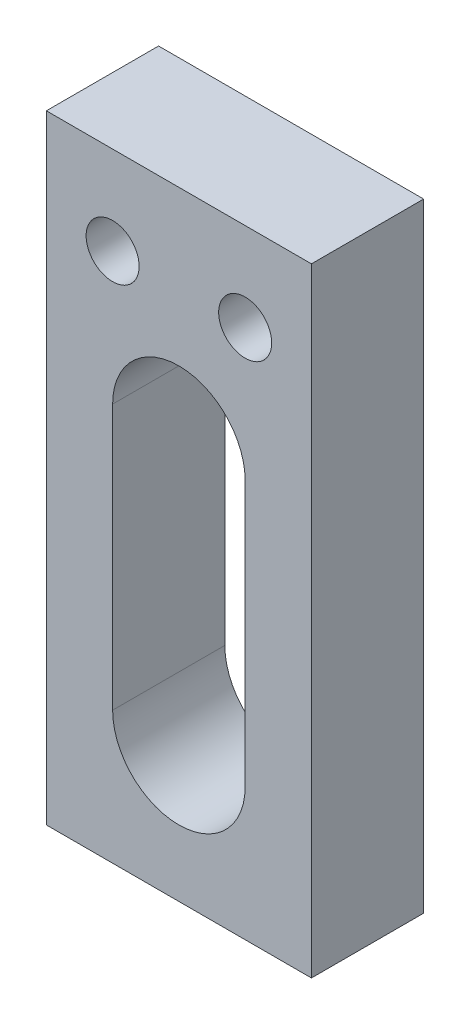
ISO-10303-21;
HEADER;
FILE_DESCRIPTION(('STEP AP214'),'2;1');
FILE_NAME('part.step','',(''),(''),'','','');
FILE_SCHEMA(('AUTOMOTIVE_DESIGN { 1 0 10303 214 1 1 1 1 }'));
ENDSEC;
DATA;
#1=APPLICATION_CONTEXT('core data for automotive mechanical design processes');
#2=APPLICATION_PROTOCOL_DEFINITION('international standard','automotive_design',2000,#1);
#3=PRODUCT_CONTEXT('',#1,'mechanical');
#4=PRODUCT('Part','Part','',(#3));
#5=PRODUCT_RELATED_PRODUCT_CATEGORY('part','',(#4));
#6=PRODUCT_DEFINITION_FORMATION('','',#4);
#7=PRODUCT_DEFINITION_CONTEXT('part definition',#1,'design');
#8=PRODUCT_DEFINITION('design','',#6,#7);
#9=PRODUCT_DEFINITION_SHAPE('','',#8);
#10=(LENGTH_UNIT() NAMED_UNIT(*) SI_UNIT(.MILLI.,.METRE.));
#11=(NAMED_UNIT(*) PLANE_ANGLE_UNIT() SI_UNIT($,.RADIAN.));
#12=(NAMED_UNIT(*) SI_UNIT($,.STERADIAN.) SOLID_ANGLE_UNIT());
#13=UNCERTAINTY_MEASURE_WITH_UNIT(LENGTH_MEASURE(1.E-05),#10,'distance_accuracy_value','');
#14=(GEOMETRIC_REPRESENTATION_CONTEXT(3) GLOBAL_UNCERTAINTY_ASSIGNED_CONTEXT((#13)) GLOBAL_UNIT_ASSIGNED_CONTEXT((#10,
#11,#12)) REPRESENTATION_CONTEXT('',''));
#15=CARTESIAN_POINT('',(0.,0.,0.));
#16=DIRECTION('',(0.,0.,1.));
#17=DIRECTION('',(1.,0.,0.));
#18=AXIS2_PLACEMENT_3D('',#15,#16,#17);
#19=CARTESIAN_POINT('',(0.,0.,12.7));
#20=DIRECTION('',(0.,0.,1.));
#21=DIRECTION('',(1.,0.,0.));
#22=AXIS2_PLACEMENT_3D('',#19,#20,#21);
#23=PLANE('',#22);
#24=CARTESIAN_POINT('',(-7.5,25.,12.7));
#25=DIRECTION('',(0.,0.,1.));
#26=DIRECTION('',(1.,0.,0.));
#27=AXIS2_PLACEMENT_3D('',#24,#25,#26);
#28=CIRCLE('',#27,3.);
#29=CARTESIAN_POINT('',(-4.5,25.,12.7));
#30=VERTEX_POINT('',#29);
#31=EDGE_CURVE('E127',#30,#30,#28,.T.);
#32=ORIENTED_EDGE('',*,*,#31,.F.);
#33=EDGE_LOOP('',(#32));
#34=FACE_BOUND('',#33,.T.);
#35=DIRECTION('',(0.,1.,0.));
#36=VECTOR('',#35,1.);
#37=CARTESIAN_POINT('',(15.,35.,12.7));
#38=LINE('',#37,#36);
#39=CARTESIAN_POINT('',(15.,-35.,12.7));
#40=VERTEX_POINT('',#39);
#41=CARTESIAN_POINT('',(15.,35.,12.7));
#42=VERTEX_POINT('',#41);
#43=EDGE_CURVE('E137',#40,#42,#38,.T.);
#44=ORIENTED_EDGE('',*,*,#43,.T.);
#45=DIRECTION('',(-1.,0.,0.));
#46=VECTOR('',#45,1.);
#47=CARTESIAN_POINT('',(-15.,35.,12.7));
#48=LINE('',#47,#46);
#49=CARTESIAN_POINT('',(-15.,35.,12.7));
#50=VERTEX_POINT('',#49);
#51=EDGE_CURVE('E140',#42,#50,#48,.T.);
#52=ORIENTED_EDGE('',*,*,#51,.T.);
#53=DIRECTION('',(0.,-1.,0.));
#54=VECTOR('',#53,1.);
#55=CARTESIAN_POINT('',(-15.,35.,12.7));
#56=LINE('',#55,#54);
#57=CARTESIAN_POINT('',(-15.,-35.,12.7));
#58=VERTEX_POINT('',#57);
#59=EDGE_CURVE('E143',#50,#58,#56,.T.);
#60=ORIENTED_EDGE('',*,*,#59,.T.);
#61=DIRECTION('',(1.,0.,0.));
#62=VECTOR('',#61,1.);
#63=CARTESIAN_POINT('',(-15.,-35.,12.7));
#64=LINE('',#63,#62);
#65=EDGE_CURVE('E145',#58,#40,#64,.T.);
#66=ORIENTED_EDGE('',*,*,#65,.T.);
#67=EDGE_LOOP('',(#44,#52,#60,#66));
#68=FACE_BOUND('',#67,.T.);
#69=DIRECTION('',(0.,-1.,0.));
#70=VECTOR('',#69,1.);
#71=CARTESIAN_POINT('',(-7.5,10.,12.7));
#72=LINE('',#71,#70);
#73=CARTESIAN_POINT('',(-7.5,10.,12.7));
#74=VERTEX_POINT('',#73);
#75=CARTESIAN_POINT('',(-7.49999999999999,-20.,12.7));
#76=VERTEX_POINT('',#75);
#77=EDGE_CURVE('E106',#74,#76,#72,.T.);
#78=ORIENTED_EDGE('',*,*,#77,.F.);
#79=CARTESIAN_POINT('',(0.,10.,12.7));
#80=DIRECTION('',(0.,0.,1.));
#81=DIRECTION('',(1.,0.,0.));
#82=AXIS2_PLACEMENT_3D('',#79,#80,#81);
#83=CIRCLE('',#82,7.49999999999999);
#84=CARTESIAN_POINT('',(7.49999999999999,10.,12.7));
#85=VERTEX_POINT('',#84);
#86=EDGE_CURVE('E98',#85,#74,#83,.T.);
#87=ORIENTED_EDGE('',*,*,#86,.F.);
#88=DIRECTION('',(0.,1.,0.));
#89=VECTOR('',#88,1.);
#90=CARTESIAN_POINT('',(7.49999999999999,10.,12.7));
#91=LINE('',#90,#89);
#92=CARTESIAN_POINT('',(7.5,-20.,12.7));
#93=VERTEX_POINT('',#92);
#94=EDGE_CURVE('E121',#93,#85,#91,.T.);
#95=ORIENTED_EDGE('',*,*,#94,.F.);
#96=CARTESIAN_POINT('',(0.,-20.,12.7));
#97=DIRECTION('',(0.,0.,1.));
#98=DIRECTION('',(1.,0.,0.));
#99=AXIS2_PLACEMENT_3D('',#96,#97,#98);
#100=CIRCLE('',#99,7.49999999999999);
#101=EDGE_CURVE('E119',#76,#93,#100,.T.);
#102=ORIENTED_EDGE('',*,*,#101,.F.);
#103=EDGE_LOOP('',(#78,#87,#95,#102));
#104=FACE_BOUND('',#103,.T.);
#105=CARTESIAN_POINT('',(7.5,25.,12.7));
#106=DIRECTION('',(0.,0.,1.));
#107=DIRECTION('',(1.,0.,0.));
#108=AXIS2_PLACEMENT_3D('',#105,#106,#107);
#109=CIRCLE('',#108,3.);
#110=CARTESIAN_POINT('',(10.5,25.,12.7));
#111=VERTEX_POINT('',#110);
#112=EDGE_CURVE('E227',#111,#111,#109,.T.);
#113=ORIENTED_EDGE('',*,*,#112,.F.);
#114=EDGE_LOOP('',(#113));
#115=FACE_BOUND('',#114,.T.);
#116=ADVANCED_FACE('F33',(#34,#68,#104,#115),#23,.T.);
#117=CARTESIAN_POINT('',(0.,0.,0.));
#118=DIRECTION('',(0.,0.,1.));
#119=DIRECTION('',(1.,0.,0.));
#120=AXIS2_PLACEMENT_3D('',#117,#118,#119);
#121=PLANE('',#120);
#122=DIRECTION('',(0.,1.,0.));
#123=VECTOR('',#122,1.);
#124=CARTESIAN_POINT('',(15.,35.,0.));
#125=LINE('',#124,#123);
#126=CARTESIAN_POINT('',(15.,-35.,0.));
#127=VERTEX_POINT('',#126);
#128=CARTESIAN_POINT('',(15.,35.,0.));
#129=VERTEX_POINT('',#128);
#130=EDGE_CURVE('E114',#127,#129,#125,.T.);
#131=ORIENTED_EDGE('',*,*,#130,.F.);
#132=DIRECTION('',(1.,0.,0.));
#133=VECTOR('',#132,1.);
#134=CARTESIAN_POINT('',(-15.,-35.,0.));
#135=LINE('',#134,#133);
#136=CARTESIAN_POINT('',(-15.,-35.,0.));
#137=VERTEX_POINT('',#136);
#138=EDGE_CURVE('E141',#137,#127,#135,.T.);
#139=ORIENTED_EDGE('',*,*,#138,.F.);
#140=DIRECTION('',(0.,-1.,0.));
#141=VECTOR('',#140,1.);
#142=CARTESIAN_POINT('',(-15.,35.,0.));
#143=LINE('',#142,#141);
#144=CARTESIAN_POINT('',(-15.,35.,0.));
#145=VERTEX_POINT('',#144);
#146=EDGE_CURVE('E152',#145,#137,#143,.T.);
#147=ORIENTED_EDGE('',*,*,#146,.F.);
#148=DIRECTION('',(-1.,0.,0.));
#149=VECTOR('',#148,1.);
#150=CARTESIAN_POINT('',(-15.,35.,0.));
#151=LINE('',#150,#149);
#152=EDGE_CURVE('E150',#129,#145,#151,.T.);
#153=ORIENTED_EDGE('',*,*,#152,.F.);
#154=EDGE_LOOP('',(#131,#139,#147,#153));
#155=FACE_BOUND('',#154,.T.);
#156=CARTESIAN_POINT('',(0.,10.,0.));
#157=DIRECTION('',(0.,0.,1.));
#158=DIRECTION('',(1.,0.,0.));
#159=AXIS2_PLACEMENT_3D('',#156,#157,#158);
#160=CIRCLE('',#159,7.49999999999999);
#161=CARTESIAN_POINT('',(7.49999999999999,10.,0.));
#162=VERTEX_POINT('',#161);
#163=CARTESIAN_POINT('',(-7.5,10.,0.));
#164=VERTEX_POINT('',#163);
#165=EDGE_CURVE('E56',#162,#164,#160,.T.);
#166=ORIENTED_EDGE('',*,*,#165,.T.);
#167=DIRECTION('',(0.,-1.,0.));
#168=VECTOR('',#167,1.);
#169=CARTESIAN_POINT('',(-7.5,10.,0.));
#170=LINE('',#169,#168);
#171=CARTESIAN_POINT('',(-7.49999999999999,-20.,0.));
#172=VERTEX_POINT('',#171);
#173=EDGE_CURVE('E113',#164,#172,#170,.T.);
#174=ORIENTED_EDGE('',*,*,#173,.T.);
#175=CARTESIAN_POINT('',(0.,-20.,0.));
#176=DIRECTION('',(0.,0.,1.));
#177=DIRECTION('',(1.,0.,0.));
#178=AXIS2_PLACEMENT_3D('',#175,#176,#177);
#179=CIRCLE('',#178,7.49999999999999);
#180=CARTESIAN_POINT('',(7.5,-20.,0.));
#181=VERTEX_POINT('',#180);
#182=EDGE_CURVE('E129',#172,#181,#179,.T.);
#183=ORIENTED_EDGE('',*,*,#182,.T.);
#184=DIRECTION('',(0.,1.,0.));
#185=VECTOR('',#184,1.);
#186=CARTESIAN_POINT('',(7.49999999999999,10.,0.));
#187=LINE('',#186,#185);
#188=EDGE_CURVE('E107',#181,#162,#187,.T.);
#189=ORIENTED_EDGE('',*,*,#188,.T.);
#190=EDGE_LOOP('',(#166,#174,#183,#189));
#191=FACE_BOUND('',#190,.T.);
#192=CARTESIAN_POINT('',(-7.5,25.,0.));
#193=DIRECTION('',(0.,0.,1.));
#194=DIRECTION('',(1.,0.,0.));
#195=AXIS2_PLACEMENT_3D('',#192,#193,#194);
#196=CIRCLE('',#195,3.);
#197=CARTESIAN_POINT('',(-4.5,25.,0.));
#198=VERTEX_POINT('',#197);
#199=EDGE_CURVE('E233',#198,#198,#196,.T.);
#200=ORIENTED_EDGE('',*,*,#199,.T.);
#201=EDGE_LOOP('',(#200));
#202=FACE_BOUND('',#201,.T.);
#203=CARTESIAN_POINT('',(7.5,25.,0.));
#204=DIRECTION('',(0.,0.,1.));
#205=DIRECTION('',(1.,0.,0.));
#206=AXIS2_PLACEMENT_3D('',#203,#204,#205);
#207=CIRCLE('',#206,3.);
#208=CARTESIAN_POINT('',(10.5,25.,0.));
#209=VERTEX_POINT('',#208);
#210=EDGE_CURVE('E230',#209,#209,#207,.T.);
#211=ORIENTED_EDGE('',*,*,#210,.T.);
#212=EDGE_LOOP('',(#211));
#213=FACE_BOUND('',#212,.T.);
#214=ADVANCED_FACE('F170',(#155,#191,#202,#213),#121,.F.);
#215=CARTESIAN_POINT('',(15.,35.,12.7));
#216=DIRECTION('',(-1.,0.,0.));
#217=DIRECTION('',(0.,-1.,0.));
#218=AXIS2_PLACEMENT_3D('',#215,#216,#217);
#219=PLANE('',#218);
#220=ORIENTED_EDGE('',*,*,#130,.T.);
#221=DIRECTION('',(0.,0.,-1.));
#222=VECTOR('',#221,1.);
#223=CARTESIAN_POINT('',(15.,35.,12.7));
#224=LINE('',#223,#222);
#225=EDGE_CURVE('E11',#42,#129,#224,.T.);
#226=ORIENTED_EDGE('',*,*,#225,.F.);
#227=ORIENTED_EDGE('',*,*,#43,.F.);
#228=DIRECTION('',(0.,0.,-1.));
#229=VECTOR('',#228,1.);
#230=CARTESIAN_POINT('',(15.,-35.,12.7));
#231=LINE('',#230,#229);
#232=EDGE_CURVE('E147',#40,#127,#231,.T.);
#233=ORIENTED_EDGE('',*,*,#232,.T.);
#234=EDGE_LOOP('',(#220,#226,#227,#233));
#235=FACE_BOUND('',#234,.T.);
#236=ADVANCED_FACE('F35',(#235),#219,.F.);
#237=CARTESIAN_POINT('',(-15.,35.,12.7));
#238=DIRECTION('',(0.,-1.,0.));
#239=DIRECTION('',(0.,0.,-1.));
#240=AXIS2_PLACEMENT_3D('',#237,#238,#239);
#241=PLANE('',#240);
#242=ORIENTED_EDGE('',*,*,#152,.T.);
#243=DIRECTION('',(0.,0.,-1.));
#244=VECTOR('',#243,1.);
#245=CARTESIAN_POINT('',(-15.,35.,12.7));
#246=LINE('',#245,#244);
#247=EDGE_CURVE('E41',#50,#145,#246,.T.);
#248=ORIENTED_EDGE('',*,*,#247,.F.);
#249=ORIENTED_EDGE('',*,*,#51,.F.);
#250=ORIENTED_EDGE('',*,*,#225,.T.);
#251=EDGE_LOOP('',(#242,#248,#249,#250));
#252=FACE_BOUND('',#251,.T.);
#253=ADVANCED_FACE('F180',(#252),#241,.F.);
#254=CARTESIAN_POINT('',(-15.,35.,12.7));
#255=DIRECTION('',(1.,0.,0.));
#256=DIRECTION('',(0.,1.,0.));
#257=AXIS2_PLACEMENT_3D('',#254,#255,#256);
#258=PLANE('',#257);
#259=ORIENTED_EDGE('',*,*,#146,.T.);
#260=DIRECTION('',(0.,0.,-1.));
#261=VECTOR('',#260,1.);
#262=CARTESIAN_POINT('',(-15.,-35.,12.7));
#263=LINE('',#262,#261);
#264=EDGE_CURVE('E157',#58,#137,#263,.T.);
#265=ORIENTED_EDGE('',*,*,#264,.F.);
#266=ORIENTED_EDGE('',*,*,#59,.F.);
#267=ORIENTED_EDGE('',*,*,#247,.T.);
#268=EDGE_LOOP('',(#259,#265,#266,#267));
#269=FACE_BOUND('',#268,.T.);
#270=ADVANCED_FACE('F164',(#269),#258,.F.);
#271=CARTESIAN_POINT('',(-15.,-35.,12.7));
#272=DIRECTION('',(0.,1.,0.));
#273=DIRECTION('',(0.,0.,1.));
#274=AXIS2_PLACEMENT_3D('',#271,#272,#273);
#275=PLANE('',#274);
#276=ORIENTED_EDGE('',*,*,#138,.T.);
#277=ORIENTED_EDGE('',*,*,#232,.F.);
#278=ORIENTED_EDGE('',*,*,#65,.F.);
#279=ORIENTED_EDGE('',*,*,#264,.T.);
#280=EDGE_LOOP('',(#276,#277,#278,#279));
#281=FACE_BOUND('',#280,.T.);
#282=ADVANCED_FACE('F174',(#281),#275,.F.);
#283=CARTESIAN_POINT('',(0.,10.,12.7));
#284=DIRECTION('',(0.,0.,-1.));
#285=DIRECTION('',(-1.,0.,0.));
#286=AXIS2_PLACEMENT_3D('',#283,#284,#285);
#287=CYLINDRICAL_SURFACE('',#286,7.49999999999999);
#288=ORIENTED_EDGE('',*,*,#165,.F.);
#289=DIRECTION('',(0.,0.,-1.));
#290=VECTOR('',#289,1.);
#291=CARTESIAN_POINT('',(7.49999999999999,10.,12.7));
#292=LINE('',#291,#290);
#293=EDGE_CURVE('E102',#85,#162,#292,.T.);
#294=ORIENTED_EDGE('',*,*,#293,.F.);
#295=ORIENTED_EDGE('',*,*,#86,.T.);
#296=DIRECTION('',(0.,0.,-1.));
#297=VECTOR('',#296,1.);
#298=CARTESIAN_POINT('',(-7.5,10.,12.7));
#299=LINE('',#298,#297);
#300=EDGE_CURVE('E101',#74,#164,#299,.T.);
#301=ORIENTED_EDGE('',*,*,#300,.T.);
#302=EDGE_LOOP('',(#288,#294,#295,#301));
#303=FACE_BOUND('',#302,.T.);
#304=ADVANCED_FACE('F100',(#303),#287,.F.);
#305=CARTESIAN_POINT('',(-7.5,10.,12.7));
#306=DIRECTION('',(1.,0.,0.));
#307=DIRECTION('',(0.,1.,0.));
#308=AXIS2_PLACEMENT_3D('',#305,#306,#307);
#309=PLANE('',#308);
#310=ORIENTED_EDGE('',*,*,#173,.F.);
#311=ORIENTED_EDGE('',*,*,#300,.F.);
#312=ORIENTED_EDGE('',*,*,#77,.T.);
#313=DIRECTION('',(0.,0.,-1.));
#314=VECTOR('',#313,1.);
#315=CARTESIAN_POINT('',(-7.49999999999999,-20.,12.7));
#316=LINE('',#315,#314);
#317=EDGE_CURVE('E115',#76,#172,#316,.T.);
#318=ORIENTED_EDGE('',*,*,#317,.T.);
#319=EDGE_LOOP('',(#310,#311,#312,#318));
#320=FACE_BOUND('',#319,.T.);
#321=ADVANCED_FACE('F110',(#320),#309,.T.);
#322=CARTESIAN_POINT('',(0.,-20.,12.7));
#323=DIRECTION('',(0.,0.,-1.));
#324=DIRECTION('',(-1.,0.,0.));
#325=AXIS2_PLACEMENT_3D('',#322,#323,#324);
#326=CYLINDRICAL_SURFACE('',#325,7.49999999999999);
#327=ORIENTED_EDGE('',*,*,#182,.F.);
#328=ORIENTED_EDGE('',*,*,#317,.F.);
#329=ORIENTED_EDGE('',*,*,#101,.T.);
#330=DIRECTION('',(0.,0.,-1.));
#331=VECTOR('',#330,1.);
#332=CARTESIAN_POINT('',(7.5,-20.,12.7));
#333=LINE('',#332,#331);
#334=EDGE_CURVE('E48',#93,#181,#333,.T.);
#335=ORIENTED_EDGE('',*,*,#334,.T.);
#336=EDGE_LOOP('',(#327,#328,#329,#335));
#337=FACE_BOUND('',#336,.T.);
#338=ADVANCED_FACE('F205',(#337),#326,.F.);
#339=CARTESIAN_POINT('',(7.49999999999999,10.,12.7));
#340=DIRECTION('',(-1.,0.,0.));
#341=DIRECTION('',(0.,-1.,0.));
#342=AXIS2_PLACEMENT_3D('',#339,#340,#341);
#343=PLANE('',#342);
#344=ORIENTED_EDGE('',*,*,#188,.F.);
#345=ORIENTED_EDGE('',*,*,#334,.F.);
#346=ORIENTED_EDGE('',*,*,#94,.T.);
#347=ORIENTED_EDGE('',*,*,#293,.T.);
#348=EDGE_LOOP('',(#344,#345,#346,#347));
#349=FACE_BOUND('',#348,.T.);
#350=ADVANCED_FACE('F209',(#349),#343,.T.);
#351=CARTESIAN_POINT('',(-7.5,25.,12.7));
#352=DIRECTION('',(0.,0.,-1.));
#353=DIRECTION('',(-1.,0.,0.));
#354=AXIS2_PLACEMENT_3D('',#351,#352,#353);
#355=CYLINDRICAL_SURFACE('',#354,3.);
#356=ORIENTED_EDGE('',*,*,#31,.T.);
#357=EDGE_LOOP('',(#356));
#358=FACE_BOUND('',#357,.T.);
#359=ORIENTED_EDGE('',*,*,#199,.F.);
#360=EDGE_LOOP('',(#359));
#361=FACE_BOUND('',#360,.T.);
#362=ADVANCED_FACE('F215',(#358,#361),#355,.F.);
#363=CARTESIAN_POINT('',(7.5,25.,12.7));
#364=DIRECTION('',(0.,0.,-1.));
#365=DIRECTION('',(-1.,0.,0.));
#366=AXIS2_PLACEMENT_3D('',#363,#364,#365);
#367=CYLINDRICAL_SURFACE('',#366,3.);
#368=ORIENTED_EDGE('',*,*,#112,.T.);
#369=EDGE_LOOP('',(#368));
#370=FACE_BOUND('',#369,.T.);
#371=ORIENTED_EDGE('',*,*,#210,.F.);
#372=EDGE_LOOP('',(#371));
#373=FACE_BOUND('',#372,.T.);
#374=ADVANCED_FACE('F218',(#370,#373),#367,.F.);
#375=CLOSED_SHELL('',(#116,#214,#236,#253,#270,#282,#304,#321,#338,#350,#362,#374));
#376=MANIFOLD_SOLID_BREP('B2',#375);
#377=ADVANCED_BREP_SHAPE_REPRESENTATION('',(#18,#376),#14);
#378=SHAPE_DEFINITION_REPRESENTATION(#9,#377);
ENDSEC;
END-ISO-10303-21;
